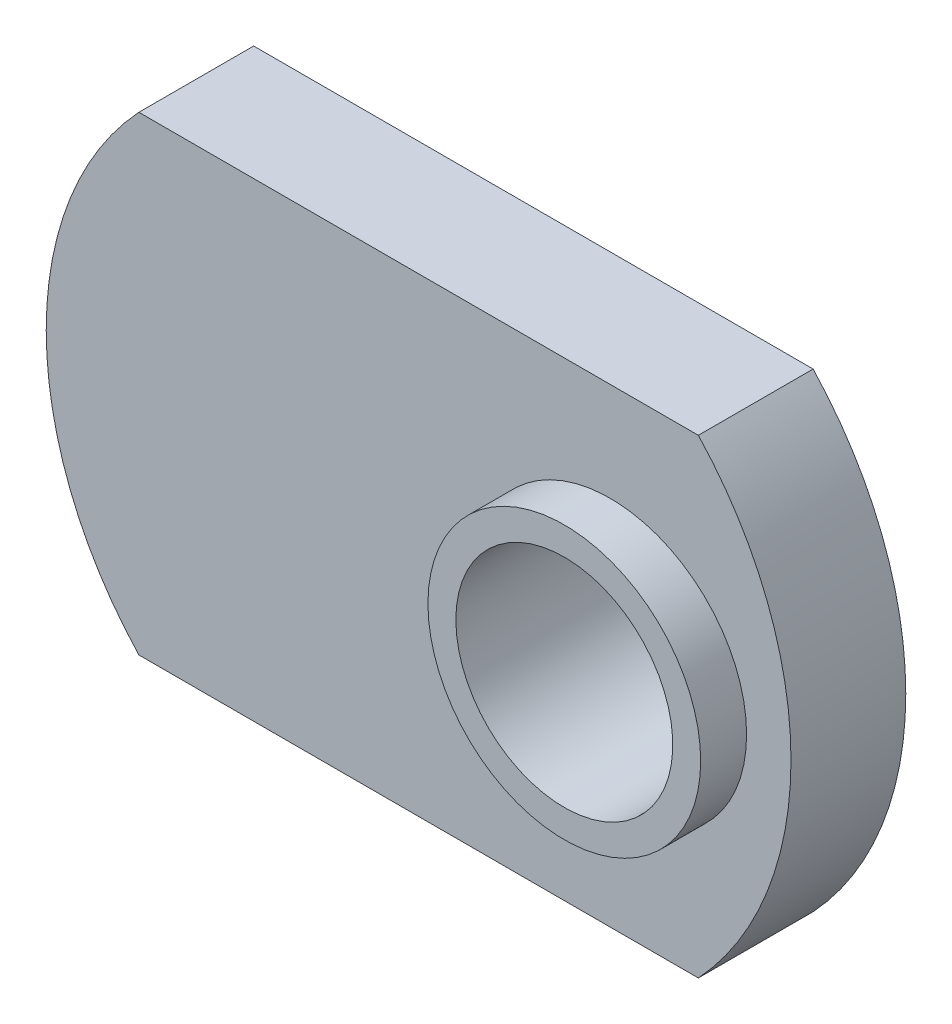
ISO-10303-21;
HEADER;
FILE_DESCRIPTION(('STEP AP214'),'2;1');
FILE_NAME('part.step','',(''),(''),'','','');
FILE_SCHEMA(('AUTOMOTIVE_DESIGN { 1 0 10303 214 1 1 1 1 }'));
ENDSEC;
DATA;
#1=APPLICATION_CONTEXT('core data for automotive mechanical design processes');
#2=APPLICATION_PROTOCOL_DEFINITION('international standard','automotive_design',2000,#1);
#3=PRODUCT_CONTEXT('',#1,'mechanical');
#4=PRODUCT('Part','Part','',(#3));
#5=PRODUCT_RELATED_PRODUCT_CATEGORY('part','',(#4));
#6=PRODUCT_DEFINITION_FORMATION('','',#4);
#7=PRODUCT_DEFINITION_CONTEXT('part definition',#1,'design');
#8=PRODUCT_DEFINITION('design','',#6,#7);
#9=PRODUCT_DEFINITION_SHAPE('','',#8);
#10=(LENGTH_UNIT() NAMED_UNIT(*) SI_UNIT(.MILLI.,.METRE.));
#11=(NAMED_UNIT(*) PLANE_ANGLE_UNIT() SI_UNIT($,.RADIAN.));
#12=(NAMED_UNIT(*) SI_UNIT($,.STERADIAN.) SOLID_ANGLE_UNIT());
#13=UNCERTAINTY_MEASURE_WITH_UNIT(LENGTH_MEASURE(1.E-05),#10,'distance_accuracy_value','');
#14=(GEOMETRIC_REPRESENTATION_CONTEXT(3) GLOBAL_UNCERTAINTY_ASSIGNED_CONTEXT((#13)) GLOBAL_UNIT_ASSIGNED_CONTEXT((#10,
#11,#12)) REPRESENTATION_CONTEXT('',''));
#15=CARTESIAN_POINT('',(0.,0.,0.));
#16=DIRECTION('',(0.,0.,1.));
#17=DIRECTION('',(1.,0.,0.));
#18=AXIS2_PLACEMENT_3D('',#15,#16,#17);
#19=CARTESIAN_POINT('',(112.828662660247,126.720465895994,3.175));
#20=DIRECTION('',(0.,0.,1.));
#21=DIRECTION('',(1.,0.,0.));
#22=AXIS2_PLACEMENT_3D('',#19,#20,#21);
#23=PLANE('',#22);
#24=CARTESIAN_POINT('',(112.828662660247,126.720465895994,3.175));
#25=DIRECTION('',(0.,0.,1.));
#26=DIRECTION('',(1.,0.,0.));
#27=AXIS2_PLACEMENT_3D('',#24,#25,#26);
#28=CIRCLE('',#27,9.525);
#29=CARTESIAN_POINT('',(119.791106555892,120.220465895994,3.175));
#30=VERTEX_POINT('',#29);
#31=CARTESIAN_POINT('',(119.791106555892,133.220465895994,3.175));
#32=VERTEX_POINT('',#31);
#33=EDGE_CURVE('E85',#30,#32,#28,.T.);
#34=ORIENTED_EDGE('',*,*,#33,.T.);
#35=DIRECTION('',(-1.,0.,0.));
#36=VECTOR('',#35,1.);
#37=CARTESIAN_POINT('',(104.316218764602,133.220465895994,3.175));
#38=LINE('',#37,#36);
#39=CARTESIAN_POINT('',(104.316218764602,133.220465895994,3.175));
#40=VERTEX_POINT('',#39);
#41=EDGE_CURVE('E80',#32,#40,#38,.T.);
#42=ORIENTED_EDGE('',*,*,#41,.T.);
#43=CARTESIAN_POINT('',(111.278662660247,126.720465895994,3.175));
#44=DIRECTION('',(0.,0.,1.));
#45=DIRECTION('',(-1.,0.,0.));
#46=AXIS2_PLACEMENT_3D('',#43,#44,#45);
#47=CIRCLE('',#46,9.52499999999998);
#48=CARTESIAN_POINT('',(104.316218764602,120.220465895994,3.175));
#49=VERTEX_POINT('',#48);
#50=EDGE_CURVE('E83',#40,#49,#47,.T.);
#51=ORIENTED_EDGE('',*,*,#50,.T.);
#52=DIRECTION('',(1.,0.,0.));
#53=VECTOR('',#52,1.);
#54=CARTESIAN_POINT('',(104.316218764602,120.220465895994,3.175));
#55=LINE('',#54,#53);
#56=EDGE_CURVE('E50',#49,#30,#55,.T.);
#57=ORIENTED_EDGE('',*,*,#56,.T.);
#58=EDGE_LOOP('',(#34,#42,#51,#57));
#59=FACE_BOUND('',#58,.T.);
#60=CARTESIAN_POINT('',(117.353662660247,126.720465895994,3.175));
#61=DIRECTION('',(0.,0.,1.));
#62=DIRECTION('',(1.,0.,0.));
#63=AXIS2_PLACEMENT_3D('',#60,#61,#62);
#64=CIRCLE('',#63,3.77199999999999);
#65=CARTESIAN_POINT('',(121.125662660247,126.720465895994,3.175));
#66=VERTEX_POINT('',#65);
#67=EDGE_CURVE('E111',#66,#66,#64,.T.);
#68=ORIENTED_EDGE('',*,*,#67,.F.);
#69=EDGE_LOOP('',(#68));
#70=FACE_BOUND('',#69,.T.);
#71=ADVANCED_FACE('F33',(#59,#70),#23,.T.);
#72=CARTESIAN_POINT('',(112.828662660247,126.720465895994,3.175));
#73=DIRECTION('',(0.,0.,-1.));
#74=DIRECTION('',(-1.,0.,0.));
#75=AXIS2_PLACEMENT_3D('',#72,#73,#74);
#76=CYLINDRICAL_SURFACE('',#75,9.525);
#77=CARTESIAN_POINT('',(112.828662660247,126.720465895994,0.));
#78=DIRECTION('',(0.,0.,1.));
#79=DIRECTION('',(1.,0.,0.));
#80=AXIS2_PLACEMENT_3D('',#77,#78,#79);
#81=CIRCLE('',#80,9.525);
#82=CARTESIAN_POINT('',(119.791106555892,120.220465895994,0.));
#83=VERTEX_POINT('',#82);
#84=CARTESIAN_POINT('',(119.791106555892,133.220465895994,0.));
#85=VERTEX_POINT('',#84);
#86=EDGE_CURVE('E97',#83,#85,#81,.T.);
#87=ORIENTED_EDGE('',*,*,#86,.T.);
#88=DIRECTION('',(0.,0.,-1.));
#89=VECTOR('',#88,1.);
#90=CARTESIAN_POINT('',(119.791106555892,133.220465895994,3.175));
#91=LINE('',#90,#89);
#92=EDGE_CURVE('E11',#32,#85,#91,.T.);
#93=ORIENTED_EDGE('',*,*,#92,.F.);
#94=ORIENTED_EDGE('',*,*,#33,.F.);
#95=DIRECTION('',(0.,0.,-1.));
#96=VECTOR('',#95,1.);
#97=CARTESIAN_POINT('',(119.791106555892,120.220465895994,3.175));
#98=LINE('',#97,#96);
#99=EDGE_CURVE('E93',#30,#83,#98,.T.);
#100=ORIENTED_EDGE('',*,*,#99,.T.);
#101=EDGE_LOOP('',(#87,#93,#94,#100));
#102=FACE_BOUND('',#101,.T.);
#103=ADVANCED_FACE('F35',(#102),#76,.T.);
#104=CARTESIAN_POINT('',(104.316218764602,133.220465895994,3.175));
#105=DIRECTION('',(0.,-1.,0.));
#106=DIRECTION('',(0.,0.,-1.));
#107=AXIS2_PLACEMENT_3D('',#104,#105,#106);
#108=PLANE('',#107);
#109=DIRECTION('',(-1.,0.,0.));
#110=VECTOR('',#109,1.);
#111=CARTESIAN_POINT('',(104.316218764602,133.220465895994,0.));
#112=LINE('',#111,#110);
#113=CARTESIAN_POINT('',(104.316218764602,133.220465895994,0.));
#114=VERTEX_POINT('',#113);
#115=EDGE_CURVE('E89',#85,#114,#112,.T.);
#116=ORIENTED_EDGE('',*,*,#115,.T.);
#117=DIRECTION('',(0.,0.,-1.));
#118=VECTOR('',#117,1.);
#119=CARTESIAN_POINT('',(104.316218764602,133.220465895994,3.175));
#120=LINE('',#119,#118);
#121=EDGE_CURVE('E42',#40,#114,#120,.T.);
#122=ORIENTED_EDGE('',*,*,#121,.F.);
#123=ORIENTED_EDGE('',*,*,#41,.F.);
#124=ORIENTED_EDGE('',*,*,#92,.T.);
#125=EDGE_LOOP('',(#116,#122,#123,#124));
#126=FACE_BOUND('',#125,.T.);
#127=ADVANCED_FACE('F88',(#126),#108,.F.);
#128=CARTESIAN_POINT('',(111.278662660247,126.720465895994,3.175));
#129=DIRECTION('',(0.,0.,-1.));
#130=DIRECTION('',(-1.,0.,0.));
#131=AXIS2_PLACEMENT_3D('',#128,#129,#130);
#132=CYLINDRICAL_SURFACE('',#131,9.52499999999998);
#133=CARTESIAN_POINT('',(111.278662660247,126.720465895994,0.));
#134=DIRECTION('',(0.,0.,1.));
#135=DIRECTION('',(-1.,0.,0.));
#136=AXIS2_PLACEMENT_3D('',#133,#134,#135);
#137=CIRCLE('',#136,9.52499999999998);
#138=CARTESIAN_POINT('',(104.316218764602,120.220465895994,0.));
#139=VERTEX_POINT('',#138);
#140=EDGE_CURVE('E67',#114,#139,#137,.T.);
#141=ORIENTED_EDGE('',*,*,#140,.T.);
#142=DIRECTION('',(0.,0.,-1.));
#143=VECTOR('',#142,1.);
#144=CARTESIAN_POINT('',(104.316218764602,120.220465895994,3.175));
#145=LINE('',#144,#143);
#146=EDGE_CURVE('E90',#49,#139,#145,.T.);
#147=ORIENTED_EDGE('',*,*,#146,.F.);
#148=ORIENTED_EDGE('',*,*,#50,.F.);
#149=ORIENTED_EDGE('',*,*,#121,.T.);
#150=EDGE_LOOP('',(#141,#147,#148,#149));
#151=FACE_BOUND('',#150,.T.);
#152=ADVANCED_FACE('F91',(#151),#132,.T.);
#153=CARTESIAN_POINT('',(104.316218764602,120.220465895994,3.175));
#154=DIRECTION('',(0.,1.,0.));
#155=DIRECTION('',(0.,0.,1.));
#156=AXIS2_PLACEMENT_3D('',#153,#154,#155);
#157=PLANE('',#156);
#158=DIRECTION('',(1.,0.,0.));
#159=VECTOR('',#158,1.);
#160=CARTESIAN_POINT('',(104.316218764602,120.220465895994,0.));
#161=LINE('',#160,#159);
#162=EDGE_CURVE('E73',#139,#83,#161,.T.);
#163=ORIENTED_EDGE('',*,*,#162,.T.);
#164=ORIENTED_EDGE('',*,*,#99,.F.);
#165=ORIENTED_EDGE('',*,*,#56,.F.);
#166=ORIENTED_EDGE('',*,*,#146,.T.);
#167=EDGE_LOOP('',(#163,#164,#165,#166));
#168=FACE_BOUND('',#167,.T.);
#169=ADVANCED_FACE('F105',(#168),#157,.F.);
#170=CARTESIAN_POINT('',(112.828662660247,126.720465895994,0.));
#171=DIRECTION('',(0.,0.,1.));
#172=DIRECTION('',(1.,0.,0.));
#173=AXIS2_PLACEMENT_3D('',#170,#171,#172);
#174=PLANE('',#173);
#175=CARTESIAN_POINT('',(117.353662660247,126.720465895994,0.));
#176=DIRECTION('',(0.,0.,-1.));
#177=DIRECTION('',(-1.,0.,0.));
#178=AXIS2_PLACEMENT_3D('',#175,#176,#177);
#179=CIRCLE('',#178,3.00000000000001);
#180=CARTESIAN_POINT('',(114.353662660247,126.720465895994,0.));
#181=VERTEX_POINT('',#180);
#182=EDGE_CURVE('E117',#181,#181,#179,.T.);
#183=ORIENTED_EDGE('',*,*,#182,.F.);
#184=EDGE_LOOP('',(#183));
#185=FACE_BOUND('',#184,.T.);
#186=ORIENTED_EDGE('',*,*,#86,.F.);
#187=ORIENTED_EDGE('',*,*,#162,.F.);
#188=ORIENTED_EDGE('',*,*,#140,.F.);
#189=ORIENTED_EDGE('',*,*,#115,.F.);
#190=EDGE_LOOP('',(#186,#187,#188,#189));
#191=FACE_BOUND('',#190,.T.);
#192=ADVANCED_FACE('F108',(#185,#191),#174,.F.);
#193=CARTESIAN_POINT('',(117.353662660247,126.720465895994,4.445));
#194=DIRECTION('',(0.,0.,-1.));
#195=DIRECTION('',(-1.,0.,0.));
#196=AXIS2_PLACEMENT_3D('',#193,#194,#195);
#197=CYLINDRICAL_SURFACE('',#196,3.77199999999999);
#198=CARTESIAN_POINT('',(117.353662660247,126.720465895994,4.445));
#199=DIRECTION('',(0.,0.,1.));
#200=DIRECTION('',(1.,0.,0.));
#201=AXIS2_PLACEMENT_3D('',#198,#199,#200);
#202=CIRCLE('',#201,3.77199999999999);
#203=CARTESIAN_POINT('',(121.125662660247,126.720465895994,4.445));
#204=VERTEX_POINT('',#203);
#205=EDGE_CURVE('E100',#204,#204,#202,.T.);
#206=ORIENTED_EDGE('',*,*,#205,.F.);
#207=EDGE_LOOP('',(#206));
#208=FACE_BOUND('',#207,.T.);
#209=ORIENTED_EDGE('',*,*,#67,.T.);
#210=EDGE_LOOP('',(#209));
#211=FACE_BOUND('',#210,.T.);
#212=ADVANCED_FACE('F133',(#208,#211),#197,.T.);
#213=CARTESIAN_POINT('',(117.353662660247,126.720465895994,4.445));
#214=DIRECTION('',(0.,0.,1.));
#215=DIRECTION('',(1.,0.,0.));
#216=AXIS2_PLACEMENT_3D('',#213,#214,#215);
#217=PLANE('',#216);
#218=CARTESIAN_POINT('',(117.353662660247,126.720465895994,4.445));
#219=DIRECTION('',(0.,0.,-1.));
#220=DIRECTION('',(-1.,0.,0.));
#221=AXIS2_PLACEMENT_3D('',#218,#219,#220);
#222=CIRCLE('',#221,3.00000000000001);
#223=CARTESIAN_POINT('',(114.353662660247,126.720465895994,4.445));
#224=VERTEX_POINT('',#223);
#225=EDGE_CURVE('E114',#224,#224,#222,.T.);
#226=ORIENTED_EDGE('',*,*,#225,.T.);
#227=EDGE_LOOP('',(#226));
#228=FACE_BOUND('',#227,.T.);
#229=ORIENTED_EDGE('',*,*,#205,.T.);
#230=EDGE_LOOP('',(#229));
#231=FACE_BOUND('',#230,.T.);
#232=ADVANCED_FACE('F123',(#228,#231),#217,.T.);
#233=CARTESIAN_POINT('',(117.353662660247,126.720465895994,4.445));
#234=DIRECTION('',(0.,0.,-1.));
#235=DIRECTION('',(-1.,0.,0.));
#236=AXIS2_PLACEMENT_3D('',#233,#234,#235);
#237=CYLINDRICAL_SURFACE('',#236,3.00000000000001);
#238=CARTESIAN_POINT('',(114.353662660247,126.720465895994,4.445));
#239=CARTESIAN_POINT('',(114.353662660247,126.720465895994,4.39869791666667));
#240=CARTESIAN_POINT('',(114.353662660247,126.720465895994,4.35239583333333));
#241=CARTESIAN_POINT('',(114.353662660247,126.720465895994,4.25979166666667));
#242=CARTESIAN_POINT('',(114.353662660247,126.720465895994,4.21348958333333));
#243=CARTESIAN_POINT('',(114.353662660247,126.720465895994,4.12088541666667));
#244=CARTESIAN_POINT('',(114.353662660247,126.720465895994,4.07458333333333));
#245=CARTESIAN_POINT('',(114.353662660247,126.720465895994,3.98197916666667));
#246=CARTESIAN_POINT('',(114.353662660247,126.720465895994,3.93567708333333));
#247=CARTESIAN_POINT('',(114.353662660247,126.720465895994,3.84307291666667));
#248=CARTESIAN_POINT('',(114.353662660247,126.720465895994,3.79677083333333));
#249=CARTESIAN_POINT('',(114.353662660247,126.720465895994,3.70416666666667));
#250=CARTESIAN_POINT('',(114.353662660247,126.720465895994,3.65786458333333));
#251=CARTESIAN_POINT('',(114.353662660247,126.720465895994,3.56526041666667));
#252=CARTESIAN_POINT('',(114.353662660247,126.720465895994,3.51895833333333));
#253=CARTESIAN_POINT('',(114.353662660247,126.720465895994,3.42635416666667));
#254=CARTESIAN_POINT('',(114.353662660247,126.720465895994,3.38005208333333));
#255=CARTESIAN_POINT('',(114.353662660247,126.720465895994,3.28744791666667));
#256=CARTESIAN_POINT('',(114.353662660247,126.720465895994,3.24114583333333));
#257=CARTESIAN_POINT('',(114.353662660247,126.720465895994,3.14854166666667));
#258=CARTESIAN_POINT('',(114.353662660247,126.720465895994,3.10223958333333));
#259=CARTESIAN_POINT('',(114.353662660247,126.720465895994,3.00963541666667));
#260=CARTESIAN_POINT('',(114.353662660247,126.720465895994,2.96333333333333));
#261=CARTESIAN_POINT('',(114.353662660247,126.720465895994,2.87072916666667));
#262=CARTESIAN_POINT('',(114.353662660247,126.720465895994,2.82442708333333));
#263=CARTESIAN_POINT('',(114.353662660247,126.720465895994,2.73182291666667));
#264=CARTESIAN_POINT('',(114.353662660247,126.720465895994,2.68552083333333));
#265=CARTESIAN_POINT('',(114.353662660247,126.720465895994,2.59291666666667));
#266=CARTESIAN_POINT('',(114.353662660247,126.720465895994,2.54661458333333));
#267=CARTESIAN_POINT('',(114.353662660247,126.720465895994,2.45401041666667));
#268=CARTESIAN_POINT('',(114.353662660247,126.720465895994,2.40770833333333));
#269=CARTESIAN_POINT('',(114.353662660247,126.720465895994,2.31510416666667));
#270=CARTESIAN_POINT('',(114.353662660247,126.720465895994,2.26880208333333));
#271=CARTESIAN_POINT('',(114.353662660247,126.720465895994,2.17619791666667));
#272=CARTESIAN_POINT('',(114.353662660247,126.720465895994,2.12989583333333));
#273=CARTESIAN_POINT('',(114.353662660247,126.720465895994,2.03729166666667));
#274=CARTESIAN_POINT('',(114.353662660247,126.720465895994,1.99098958333333));
#275=CARTESIAN_POINT('',(114.353662660247,126.720465895994,1.89838541666667));
#276=CARTESIAN_POINT('',(114.353662660247,126.720465895994,1.85208333333333));
#277=CARTESIAN_POINT('',(114.353662660247,126.720465895994,1.75947916666667));
#278=CARTESIAN_POINT('',(114.353662660247,126.720465895994,1.71317708333333));
#279=CARTESIAN_POINT('',(114.353662660247,126.720465895994,1.62057291666667));
#280=CARTESIAN_POINT('',(114.353662660247,126.720465895994,1.57427083333333));
#281=CARTESIAN_POINT('',(114.353662660247,126.720465895994,1.48166666666667));
#282=CARTESIAN_POINT('',(114.353662660247,126.720465895994,1.43536458333333));
#283=CARTESIAN_POINT('',(114.353662660247,126.720465895994,1.34276041666667));
#284=CARTESIAN_POINT('',(114.353662660247,126.720465895994,1.29645833333333));
#285=CARTESIAN_POINT('',(114.353662660247,126.720465895994,1.20385416666667));
#286=CARTESIAN_POINT('',(114.353662660247,126.720465895994,1.15755208333333));
#287=CARTESIAN_POINT('',(114.353662660247,126.720465895994,1.06494791666667));
#288=CARTESIAN_POINT('',(114.353662660247,126.720465895994,1.01864583333333));
#289=CARTESIAN_POINT('',(114.353662660247,126.720465895994,0.926041666666667));
#290=CARTESIAN_POINT('',(114.353662660247,126.720465895994,0.879739583333333));
#291=CARTESIAN_POINT('',(114.353662660247,126.720465895994,0.787135416666667));
#292=CARTESIAN_POINT('',(114.353662660247,126.720465895994,0.740833333333333));
#293=CARTESIAN_POINT('',(114.353662660247,126.720465895994,0.648229166666667));
#294=CARTESIAN_POINT('',(114.353662660247,126.720465895994,0.601927083333334));
#295=CARTESIAN_POINT('',(114.353662660247,126.720465895994,0.509322916666667));
#296=CARTESIAN_POINT('',(114.353662660247,126.720465895994,0.463020833333334));
#297=CARTESIAN_POINT('',(114.353662660247,126.720465895994,0.370416666666667));
#298=CARTESIAN_POINT('',(114.353662660247,126.720465895994,0.324114583333334));
#299=CARTESIAN_POINT('',(114.353662660247,126.720465895994,0.231510416666667));
#300=CARTESIAN_POINT('',(114.353662660247,126.720465895994,0.185208333333334));
#301=CARTESIAN_POINT('',(114.353662660247,126.720465895994,0.0926041666666668));
#302=CARTESIAN_POINT('',(114.353662660247,126.720465895994,0.0463020833333335));
#303=CARTESIAN_POINT('',(114.353662660247,126.720465895994,0.));
#304=B_SPLINE_CURVE_WITH_KNOTS('',3,(#238,#239,#240,#241,#242,#243,#244,#245,#246,#247,#248,
#249,#250,#251,#252,#253,#254,#255,#256,#257,#258,#259,#260,#261,#262,#263,#264,#265,#266,#267,
#268,#269,#270,#271,#272,#273,#274,#275,#276,#277,#278,#279,#280,#281,#282,#283,#284,#285,#286,
#287,#288,#289,#290,#291,#292,#293,#294,#295,#296,#297,#298,#299,#300,#301,#302,#303),
.UNSPECIFIED.,.F.,.F.,(4,2,2,2,2,2,2,2,2,2,2,2,2,2,2,2,2,2,2,2,2,2,2,2,2,2,2,2,2,2,2,2,4),(0.,
0.138906249999999,0.277812499999999,0.41671875,0.555625,0.69453125,0.833437499999999,0.97234375,
1.11125,1.25015625,1.3890625,1.52796875,1.666875,1.80578125,1.9446875,2.08359375,2.2225,
2.36140625,2.5003125,2.63921875,2.778125,2.91703125,3.0559375,3.19484375,3.33375,3.47265625,
3.6115625,3.75046875,3.889375,4.02828125,4.1671875,4.30609375,4.445),.UNSPECIFIED.);
#305=EDGE_CURVE('BSEAM126',#224,#181,#304,.T.);
#306=ORIENTED_EDGE('',*,*,#225,.F.);
#307=ORIENTED_EDGE('',*,*,#182,.T.);
#308=ORIENTED_EDGE('',*,*,#305,.T.);
#309=ORIENTED_EDGE('',*,*,#305,.F.);
#310=EDGE_LOOP('',(#306,#308,#307,#309));
#311=FACE_BOUND('',#310,.T.);
#312=ADVANCED_FACE('F126',(#311),#237,.F.);
#313=CLOSED_SHELL('',(#71,#103,#127,#152,#169,#192,#212,#232,#312));
#314=MANIFOLD_SOLID_BREP('B2',#313);
#315=ADVANCED_BREP_SHAPE_REPRESENTATION('',(#18,#314),#14);
#316=SHAPE_DEFINITION_REPRESENTATION(#9,#315);
ENDSEC;
END-ISO-10303-21;
